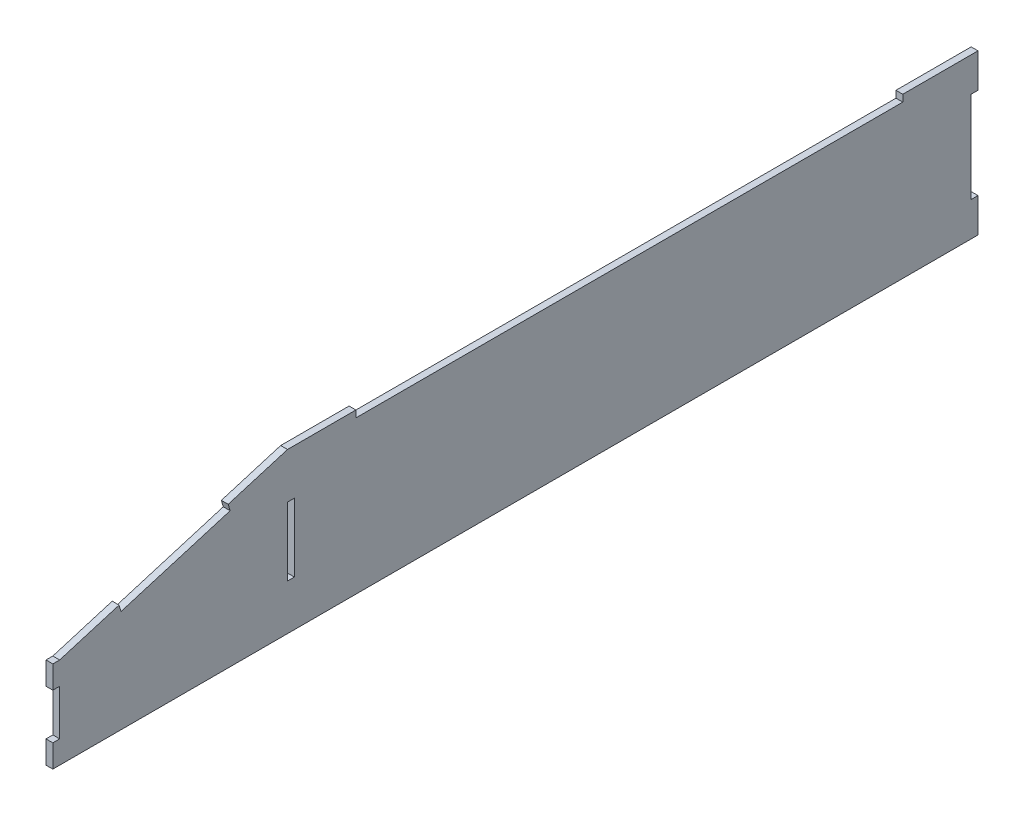
ISO-10303-21;
HEADER;
FILE_DESCRIPTION(('STEP AP214'),'2;1');
FILE_NAME('part.step','',(''),(''),'','','');
FILE_SCHEMA(('AUTOMOTIVE_DESIGN { 1 0 10303 214 1 1 1 1 }'));
ENDSEC;
DATA;
#1=APPLICATION_CONTEXT('core data for automotive mechanical design processes');
#2=APPLICATION_PROTOCOL_DEFINITION('international standard','automotive_design',2000,#1);
#3=PRODUCT_CONTEXT('',#1,'mechanical');
#4=PRODUCT('Part','Part','',(#3));
#5=PRODUCT_RELATED_PRODUCT_CATEGORY('part','',(#4));
#6=PRODUCT_DEFINITION_FORMATION('','',#4);
#7=PRODUCT_DEFINITION_CONTEXT('part definition',#1,'design');
#8=PRODUCT_DEFINITION('design','',#6,#7);
#9=PRODUCT_DEFINITION_SHAPE('','',#8);
#10=(LENGTH_UNIT() NAMED_UNIT(*) SI_UNIT(.MILLI.,.METRE.));
#11=(NAMED_UNIT(*) PLANE_ANGLE_UNIT() SI_UNIT($,.RADIAN.));
#12=(NAMED_UNIT(*) SI_UNIT($,.STERADIAN.) SOLID_ANGLE_UNIT());
#13=UNCERTAINTY_MEASURE_WITH_UNIT(LENGTH_MEASURE(1.E-05),#10,'distance_accuracy_value','');
#14=(GEOMETRIC_REPRESENTATION_CONTEXT(3) GLOBAL_UNCERTAINTY_ASSIGNED_CONTEXT((#13)) GLOBAL_UNIT_ASSIGNED_CONTEXT((#10,
#11,#12)) REPRESENTATION_CONTEXT('',''));
#15=CARTESIAN_POINT('',(0.,0.,0.));
#16=DIRECTION('',(0.,0.,1.));
#17=DIRECTION('',(1.,0.,0.));
#18=AXIS2_PLACEMENT_3D('',#15,#16,#17);
#19=CARTESIAN_POINT('',(3.,40.1738959397817,119.855679605587));
#20=DIRECTION('',(0.,0.,-1.));
#21=DIRECTION('',(-1.,0.,0.));
#22=AXIS2_PLACEMENT_3D('',#19,#20,#21);
#23=PLANE('',#22);
#24=DIRECTION('',(0.,-1.,0.));
#25=VECTOR('',#24,1.);
#26=CARTESIAN_POINT('',(3.,40.1738959397817,119.855679605587));
#27=LINE('',#26,#25);
#28=CARTESIAN_POINT('',(3.,10.1738959397816,119.855679605587));
#29=VERTEX_POINT('',#28);
#30=CARTESIAN_POINT('',(3.,0.173895939781652,119.855679605587));
#31=VERTEX_POINT('',#30);
#32=EDGE_CURVE('E368',#29,#31,#27,.T.);
#33=ORIENTED_EDGE('',*,*,#32,.F.);
#34=DIRECTION('',(-1.,0.,0.));
#35=VECTOR('',#34,1.);
#36=CARTESIAN_POINT('',(518.001516988057,10.1738959397816,119.855679605587));
#37=LINE('',#36,#35);
#38=CARTESIAN_POINT('',(0.,10.1738959397816,119.855679605587));
#39=VERTEX_POINT('',#38);
#40=EDGE_CURVE('E263',#29,#39,#37,.T.);
#41=ORIENTED_EDGE('',*,*,#40,.T.);
#42=DIRECTION('',(0.,-1.,0.));
#43=VECTOR('',#42,1.);
#44=CARTESIAN_POINT('',(0.,40.1738959397817,119.855679605587));
#45=LINE('',#44,#43);
#46=CARTESIAN_POINT('',(0.,0.173895939781652,119.855679605587));
#47=VERTEX_POINT('',#46);
#48=EDGE_CURVE('E389',#39,#47,#45,.T.);
#49=ORIENTED_EDGE('',*,*,#48,.T.);
#50=DIRECTION('',(-1.,0.,0.));
#51=VECTOR('',#50,1.);
#52=CARTESIAN_POINT('',(3.,0.173895939781652,119.855679605587));
#53=LINE('',#52,#51);
#54=EDGE_CURVE('E372',#31,#47,#53,.T.);
#55=ORIENTED_EDGE('',*,*,#54,.F.);
#56=EDGE_LOOP('',(#33,#41,#49,#55));
#57=FACE_BOUND('',#56,.T.);
#58=ADVANCED_FACE('F33',(#57),#23,.F.);
#59=CARTESIAN_POINT('',(3.,40.1738959397817,116.855679605587));
#60=DIRECTION('',(0.,-0.957826285221152,-0.287347885566345));
#61=DIRECTION('',(0.,0.287347885566345,-0.957826285221152));
#62=AXIS2_PLACEMENT_3D('',#59,#60,#61);
#63=PLANE('',#62);
#64=DIRECTION('',(0.,-0.287347885566345,0.957826285221151));
#65=VECTOR('',#64,1.);
#66=CARTESIAN_POINT('',(3.,40.1738959397817,116.855679605587));
#67=LINE('',#66,#65);
#68=CARTESIAN_POINT('',(3.,47.9906391740598,90.7998688246599));
#69=VERTEX_POINT('',#68);
#70=CARTESIAN_POINT('',(3.,40.1738959397817,116.855679605587));
#71=VERTEX_POINT('',#70);
#72=EDGE_CURVE('E362',#69,#71,#67,.T.);
#73=ORIENTED_EDGE('',*,*,#72,.F.);
#74=DIRECTION('',(-1.,0.,0.));
#75=VECTOR('',#74,1.);
#76=CARTESIAN_POINT('',(518.001516988057,47.9906391740598,90.7998688246599));
#77=LINE('',#76,#75);
#78=CARTESIAN_POINT('',(0.,47.9906391740598,90.7998688246599));
#79=VERTEX_POINT('',#78);
#80=EDGE_CURVE('E290',#69,#79,#77,.T.);
#81=ORIENTED_EDGE('',*,*,#80,.T.);
#82=DIRECTION('',(0.,-0.287347885566345,0.957826285221151));
#83=VECTOR('',#82,1.);
#84=CARTESIAN_POINT('',(0.,40.1738959397817,116.855679605587));
#85=LINE('',#84,#83);
#86=CARTESIAN_POINT('',(0.,40.1738959397817,116.855679605587));
#87=VERTEX_POINT('',#86);
#88=EDGE_CURVE('E383',#79,#87,#85,.T.);
#89=ORIENTED_EDGE('',*,*,#88,.T.);
#90=DIRECTION('',(-1.,0.,0.));
#91=VECTOR('',#90,1.);
#92=CARTESIAN_POINT('',(3.,40.1738959397817,116.855679605587));
#93=LINE('',#92,#91);
#94=EDGE_CURVE('E397',#71,#87,#93,.T.);
#95=ORIENTED_EDGE('',*,*,#94,.F.);
#96=EDGE_LOOP('',(#73,#81,#89,#95));
#97=FACE_BOUND('',#96,.T.);
#98=ADVANCED_FACE('F445',(#97),#63,.F.);
#99=CARTESIAN_POINT('',(3.,70.1738959397817,16.855679605587));
#100=DIRECTION('',(0.,-1.,0.));
#101=DIRECTION('',(0.,0.,-1.));
#102=AXIS2_PLACEMENT_3D('',#99,#100,#101);
#103=PLANE('',#102);
#104=DIRECTION('',(0.,0.,1.));
#105=VECTOR('',#104,1.);
#106=CARTESIAN_POINT('',(3.,70.1738959397817,16.855679605587));
#107=LINE('',#106,#105);
#108=CARTESIAN_POINT('',(3.,70.1738959397817,-13.144320394413));
#109=VERTEX_POINT('',#108);
#110=CARTESIAN_POINT('',(3.,70.1738959397817,16.855679605587));
#111=VERTEX_POINT('',#110);
#112=EDGE_CURVE('E358',#109,#111,#107,.T.);
#113=ORIENTED_EDGE('',*,*,#112,.F.);
#114=DIRECTION('',(-1.,0.,0.));
#115=VECTOR('',#114,1.);
#116=CARTESIAN_POINT('',(518.001516988057,70.1738959397817,-13.144320394413));
#117=LINE('',#116,#115);
#118=CARTESIAN_POINT('',(0.,70.1738959397817,-13.144320394413));
#119=VERTEX_POINT('',#118);
#120=EDGE_CURVE('E317',#109,#119,#117,.T.);
#121=ORIENTED_EDGE('',*,*,#120,.T.);
#122=DIRECTION('',(0.,0.,1.));
#123=VECTOR('',#122,1.);
#124=CARTESIAN_POINT('',(0.,70.1738959397817,16.855679605587));
#125=LINE('',#124,#123);
#126=CARTESIAN_POINT('',(0.,70.1738959397817,16.855679605587));
#127=VERTEX_POINT('',#126);
#128=EDGE_CURVE('E379',#119,#127,#125,.T.);
#129=ORIENTED_EDGE('',*,*,#128,.T.);
#130=DIRECTION('',(-1.,0.,0.));
#131=VECTOR('',#130,1.);
#132=CARTESIAN_POINT('',(3.,70.1738959397817,16.855679605587));
#133=LINE('',#132,#131);
#134=EDGE_CURVE('E400',#111,#127,#133,.T.);
#135=ORIENTED_EDGE('',*,*,#134,.F.);
#136=EDGE_LOOP('',(#113,#121,#129,#135));
#137=FACE_BOUND('',#136,.T.);
#138=ADVANCED_FACE('F427',(#137),#103,.F.);
#139=CARTESIAN_POINT('',(3.,0.173895939781676,-286.144320394413));
#140=DIRECTION('',(0.,0.,1.));
#141=DIRECTION('',(1.,0.,0.));
#142=AXIS2_PLACEMENT_3D('',#139,#140,#141);
#143=PLANE('',#142);
#144=DIRECTION('',(-1.,0.,0.));
#145=VECTOR('',#144,1.);
#146=CARTESIAN_POINT('',(521.751516988057,15.1738959397817,-286.144320394413));
#147=LINE('',#146,#145);
#148=CARTESIAN_POINT('',(3.,15.1738959397817,-286.144320394413));
#149=VERTEX_POINT('',#148);
#150=CARTESIAN_POINT('',(0.,15.1738959397817,-286.144320394413));
#151=VERTEX_POINT('',#150);
#152=EDGE_CURVE('E344',#149,#151,#147,.T.);
#153=ORIENTED_EDGE('',*,*,#152,.F.);
#154=DIRECTION('',(0.,1.,0.));
#155=VECTOR('',#154,1.);
#156=CARTESIAN_POINT('',(3.,0.173895939781676,-286.144320394413));
#157=LINE('',#156,#155);
#158=CARTESIAN_POINT('',(3.,0.173895939781676,-286.144320394413));
#159=VERTEX_POINT('',#158);
#160=EDGE_CURVE('E355',#159,#149,#157,.T.);
#161=ORIENTED_EDGE('',*,*,#160,.F.);
#162=DIRECTION('',(-1.,0.,0.));
#163=VECTOR('',#162,1.);
#164=CARTESIAN_POINT('',(3.,0.173895939781676,-286.144320394413));
#165=LINE('',#164,#163);
#166=CARTESIAN_POINT('',(0.,0.173895939781676,-286.144320394413));
#167=VERTEX_POINT('',#166);
#168=EDGE_CURVE('E11',#159,#167,#165,.T.);
#169=ORIENTED_EDGE('',*,*,#168,.T.);
#170=DIRECTION('',(0.,1.,0.));
#171=VECTOR('',#170,1.);
#172=CARTESIAN_POINT('',(0.,0.173895939781676,-286.144320394413));
#173=LINE('',#172,#171);
#174=EDGE_CURVE('E376',#167,#151,#173,.T.);
#175=ORIENTED_EDGE('',*,*,#174,.T.);
#176=EDGE_LOOP('',(#153,#161,#169,#175));
#177=FACE_BOUND('',#176,.T.);
#178=ADVANCED_FACE('F479',(#177),#143,.F.);
#179=DIRECTION('',(-1.,0.,0.));
#180=VECTOR('',#179,1.);
#181=CARTESIAN_POINT('',(521.751516988057,55.1738959397817,-286.144320394413));
#182=LINE('',#181,#180);
#183=CARTESIAN_POINT('',(3.,55.1738959397817,-286.144320394413));
#184=VERTEX_POINT('',#183);
#185=CARTESIAN_POINT('',(0.,55.1738959397817,-286.144320394413));
#186=VERTEX_POINT('',#185);
#187=EDGE_CURVE('E338',#184,#186,#182,.T.);
#188=ORIENTED_EDGE('',*,*,#187,.T.);
#189=CARTESIAN_POINT('',(0.,70.1738959397817,-286.144320394413));
#190=VERTEX_POINT('',#189);
#191=EDGE_CURVE('E375',#186,#190,#173,.T.);
#192=ORIENTED_EDGE('',*,*,#191,.T.);
#193=DIRECTION('',(-1.,0.,0.));
#194=VECTOR('',#193,1.);
#195=CARTESIAN_POINT('',(3.,70.1738959397817,-286.144320394413));
#196=LINE('',#195,#194);
#197=CARTESIAN_POINT('',(3.,70.1738959397817,-286.144320394413));
#198=VERTEX_POINT('',#197);
#199=EDGE_CURVE('E41',#198,#190,#196,.T.);
#200=ORIENTED_EDGE('',*,*,#199,.F.);
#201=EDGE_CURVE('E353',#184,#198,#157,.T.);
#202=ORIENTED_EDGE('',*,*,#201,.F.);
#203=EDGE_LOOP('',(#188,#192,#200,#202));
#204=FACE_BOUND('',#203,.T.);
#205=ADVANCED_FACE('F489',(#204),#143,.F.);
#206=CARTESIAN_POINT('',(3.,0.,0.));
#207=DIRECTION('',(1.,0.,0.));
#208=DIRECTION('',(0.,0.,-1.));
#209=AXIS2_PLACEMENT_3D('',#206,#207,#208);
#210=PLANE('',#209);
#211=DIRECTION('',(0.,0.,1.));
#212=VECTOR('',#211,1.);
#213=CARTESIAN_POINT('',(3.,50.1738959397817,13.855679605587));
#214=LINE('',#213,#212);
#215=CARTESIAN_POINT('',(3.,50.1738959397817,13.855679605587));
#216=VERTEX_POINT('',#215);
#217=CARTESIAN_POINT('',(3.,50.1738959397817,16.855679605587));
#218=VERTEX_POINT('',#217);
#219=EDGE_CURVE('E48',#216,#218,#214,.T.);
#220=ORIENTED_EDGE('',*,*,#219,.F.);
#221=DIRECTION('',(0.,1.,0.));
#222=VECTOR('',#221,1.);
#223=CARTESIAN_POINT('',(3.,20.1738959397817,13.855679605587));
#224=LINE('',#223,#222);
#225=CARTESIAN_POINT('',(3.,20.1738959397817,13.855679605587));
#226=VERTEX_POINT('',#225);
#227=EDGE_CURVE('E224',#226,#216,#224,.T.);
#228=ORIENTED_EDGE('',*,*,#227,.F.);
#229=DIRECTION('',(0.,0.,-1.));
#230=VECTOR('',#229,1.);
#231=CARTESIAN_POINT('',(3.,20.1738959397817,16.855679605587));
#232=LINE('',#231,#230);
#233=CARTESIAN_POINT('',(3.,20.1738959397817,16.855679605587));
#234=VERTEX_POINT('',#233);
#235=EDGE_CURVE('E227',#234,#226,#232,.T.);
#236=ORIENTED_EDGE('',*,*,#235,.F.);
#237=DIRECTION('',(0.,-1.,0.));
#238=VECTOR('',#237,1.);
#239=CARTESIAN_POINT('',(3.,50.1738959397817,16.855679605587));
#240=LINE('',#239,#238);
#241=EDGE_CURVE('E233',#218,#234,#240,.T.);
#242=ORIENTED_EDGE('',*,*,#241,.F.);
#243=EDGE_LOOP('',(#220,#228,#236,#242));
#244=FACE_BOUND('',#243,.T.);
#245=DIRECTION('',(0.,0.,1.));
#246=VECTOR('',#245,1.);
#247=CARTESIAN_POINT('',(3.,10.1738959397816,116.855679605587));
#248=LINE('',#247,#246);
#249=CARTESIAN_POINT('',(3.,10.1738959397816,116.855679605587));
#250=VERTEX_POINT('',#249);
#251=EDGE_CURVE('E246',#250,#29,#248,.T.);
#252=ORIENTED_EDGE('',*,*,#251,.T.);
#253=ORIENTED_EDGE('',*,*,#32,.T.);
#254=DIRECTION('',(0.,0.,-1.));
#255=VECTOR('',#254,1.);
#256=CARTESIAN_POINT('',(3.,0.173895939781652,119.855679605587));
#257=LINE('',#256,#255);
#258=EDGE_CURVE('E350',#31,#159,#257,.T.);
#259=ORIENTED_EDGE('',*,*,#258,.T.);
#260=ORIENTED_EDGE('',*,*,#160,.T.);
#261=DIRECTION('',(0.,0.,-1.));
#262=VECTOR('',#261,1.);
#263=CARTESIAN_POINT('',(3.,15.1738959397817,-283.144320394413));
#264=LINE('',#263,#262);
#265=CARTESIAN_POINT('',(3.,15.1738959397817,-283.144320394413));
#266=VERTEX_POINT('',#265);
#267=EDGE_CURVE('E327',#266,#149,#264,.T.);
#268=ORIENTED_EDGE('',*,*,#267,.F.);
#269=DIRECTION('',(0.,-1.,0.));
#270=VECTOR('',#269,1.);
#271=CARTESIAN_POINT('',(3.,55.1738959397817,-283.144320394413));
#272=LINE('',#271,#270);
#273=CARTESIAN_POINT('',(3.,55.1738959397817,-283.144320394413));
#274=VERTEX_POINT('',#273);
#275=EDGE_CURVE('E324',#274,#266,#272,.T.);
#276=ORIENTED_EDGE('',*,*,#275,.F.);
#277=DIRECTION('',(0.,0.,1.));
#278=VECTOR('',#277,1.);
#279=CARTESIAN_POINT('',(3.,55.1738959397817,-286.144320394413));
#280=LINE('',#279,#278);
#281=EDGE_CURVE('E326',#184,#274,#280,.T.);
#282=ORIENTED_EDGE('',*,*,#281,.F.);
#283=ORIENTED_EDGE('',*,*,#201,.T.);
#284=CARTESIAN_POINT('',(3.,70.1738959397817,-253.144320394413));
#285=VERTEX_POINT('',#284);
#286=EDGE_CURVE('E359',#198,#285,#107,.T.);
#287=ORIENTED_EDGE('',*,*,#286,.T.);
#288=DIRECTION('',(0.,-1.,0.));
#289=VECTOR('',#288,1.);
#290=CARTESIAN_POINT('',(3.,70.1738959397817,-253.144320394413));
#291=LINE('',#290,#289);
#292=CARTESIAN_POINT('',(3.,67.1738959397817,-253.144320394413));
#293=VERTEX_POINT('',#292);
#294=EDGE_CURVE('E299',#285,#293,#291,.T.);
#295=ORIENTED_EDGE('',*,*,#294,.T.);
#296=DIRECTION('',(0.,0.,1.));
#297=VECTOR('',#296,1.);
#298=CARTESIAN_POINT('',(3.,67.1738959397817,-253.144320394413));
#299=LINE('',#298,#297);
#300=CARTESIAN_POINT('',(3.,67.1738959397817,-13.144320394413));
#301=VERTEX_POINT('',#300);
#302=EDGE_CURVE('E297',#293,#301,#299,.T.);
#303=ORIENTED_EDGE('',*,*,#302,.T.);
#304=DIRECTION('',(0.,1.,0.));
#305=VECTOR('',#304,1.);
#306=CARTESIAN_POINT('',(3.,67.1738959397817,-13.144320394413));
#307=LINE('',#306,#305);
#308=EDGE_CURVE('E300',#301,#109,#307,.T.);
#309=ORIENTED_EDGE('',*,*,#308,.T.);
#310=ORIENTED_EDGE('',*,*,#112,.T.);
#311=CARTESIAN_POINT('',(3.,62.3580334523771,42.9085545636023));
#312=VERTEX_POINT('',#311);
#313=EDGE_CURVE('E363',#111,#312,#67,.T.);
#314=ORIENTED_EDGE('',*,*,#313,.T.);
#315=DIRECTION('',(0.,-0.957826285221151,-0.287347885566347));
#316=VECTOR('',#315,1.);
#317=CARTESIAN_POINT('',(3.,62.3580334523771,42.9085545636023));
#318=LINE('',#317,#316);
#319=CARTESIAN_POINT('',(3.,59.4845545967136,42.0465109069033));
#320=VERTEX_POINT('',#319);
#321=EDGE_CURVE('E272',#312,#320,#318,.T.);
#322=ORIENTED_EDGE('',*,*,#321,.T.);
#323=DIRECTION('',(0.,-0.287347885566347,0.957826285221151));
#324=VECTOR('',#323,1.);
#325=CARTESIAN_POINT('',(3.,59.4845545967136,42.0465109069033));
#326=LINE('',#325,#324);
#327=CARTESIAN_POINT('',(3.,45.1171603183962,89.9378251679608));
#328=VERTEX_POINT('',#327);
#329=EDGE_CURVE('E270',#320,#328,#326,.T.);
#330=ORIENTED_EDGE('',*,*,#329,.T.);
#331=DIRECTION('',(0.,0.957826285221151,0.287347885566349));
#332=VECTOR('',#331,1.);
#333=CARTESIAN_POINT('',(3.,45.1171603183963,89.9378251679608));
#334=LINE('',#333,#332);
#335=EDGE_CURVE('E273',#328,#69,#334,.T.);
#336=ORIENTED_EDGE('',*,*,#335,.T.);
#337=ORIENTED_EDGE('',*,*,#72,.T.);
#338=DIRECTION('',(0.,0.,1.));
#339=VECTOR('',#338,1.);
#340=CARTESIAN_POINT('',(3.,40.1738959397817,119.855679605587));
#341=LINE('',#340,#339);
#342=CARTESIAN_POINT('',(3.,40.1738959397817,119.855679605587));
#343=VERTEX_POINT('',#342);
#344=EDGE_CURVE('E366',#71,#343,#341,.T.);
#345=ORIENTED_EDGE('',*,*,#344,.T.);
#346=CARTESIAN_POINT('',(3.,30.1738959397816,119.855679605587));
#347=VERTEX_POINT('',#346);
#348=EDGE_CURVE('E369',#343,#347,#27,.T.);
#349=ORIENTED_EDGE('',*,*,#348,.T.);
#350=DIRECTION('',(0.,0.,-1.));
#351=VECTOR('',#350,1.);
#352=CARTESIAN_POINT('',(3.,30.1738959397816,119.855679605587));
#353=LINE('',#352,#351);
#354=CARTESIAN_POINT('',(3.,30.1738959397817,116.855679605587));
#355=VERTEX_POINT('',#354);
#356=EDGE_CURVE('E245',#347,#355,#353,.T.);
#357=ORIENTED_EDGE('',*,*,#356,.T.);
#358=DIRECTION('',(0.,-1.,0.));
#359=VECTOR('',#358,1.);
#360=CARTESIAN_POINT('',(3.,30.1738959397817,116.855679605587));
#361=LINE('',#360,#359);
#362=EDGE_CURVE('E243',#355,#250,#361,.T.);
#363=ORIENTED_EDGE('',*,*,#362,.T.);
#364=EDGE_LOOP('',(#252,#253,#259,#260,#268,#276,#282,#283,#287,#295,#303,#309,#310,#314,#322,
#330,#336,#337,#345,#349,#357,#363));
#365=FACE_BOUND('',#364,.T.);
#366=ADVANCED_FACE('F421',(#244,#365),#210,.T.);
#367=CARTESIAN_POINT('',(3.,0.173895939781652,119.855679605587));
#368=DIRECTION('',(0.,1.,0.));
#369=DIRECTION('',(0.,0.,1.));
#370=AXIS2_PLACEMENT_3D('',#367,#368,#369);
#371=PLANE('',#370);
#372=DIRECTION('',(0.,0.,-1.));
#373=VECTOR('',#372,1.);
#374=CARTESIAN_POINT('',(0.,0.173895939781652,119.855679605587));
#375=LINE('',#374,#373);
#376=EDGE_CURVE('E329',#47,#167,#375,.T.);
#377=ORIENTED_EDGE('',*,*,#376,.T.);
#378=ORIENTED_EDGE('',*,*,#168,.F.);
#379=ORIENTED_EDGE('',*,*,#258,.F.);
#380=ORIENTED_EDGE('',*,*,#54,.T.);
#381=EDGE_LOOP('',(#377,#378,#379,#380));
#382=FACE_BOUND('',#381,.T.);
#383=ADVANCED_FACE('F35',(#382),#371,.F.);
#384=CARTESIAN_POINT('',(0.,70.1738959397817,-253.144320394413));
#385=VERTEX_POINT('',#384);
#386=EDGE_CURVE('E380',#190,#385,#125,.T.);
#387=ORIENTED_EDGE('',*,*,#386,.T.);
#388=DIRECTION('',(-1.,0.,0.));
#389=VECTOR('',#388,1.);
#390=CARTESIAN_POINT('',(518.001516988057,70.1738959397817,-253.144320394413));
#391=LINE('',#390,#389);
#392=EDGE_CURVE('E311',#285,#385,#391,.T.);
#393=ORIENTED_EDGE('',*,*,#392,.F.);
#394=ORIENTED_EDGE('',*,*,#286,.F.);
#395=ORIENTED_EDGE('',*,*,#199,.T.);
#396=EDGE_LOOP('',(#387,#393,#394,#395));
#397=FACE_BOUND('',#396,.T.);
#398=ADVANCED_FACE('F407',(#397),#103,.F.);
#399=CARTESIAN_POINT('',(0.,62.3580334523771,42.9085545636023));
#400=VERTEX_POINT('',#399);
#401=EDGE_CURVE('E384',#127,#400,#85,.T.);
#402=ORIENTED_EDGE('',*,*,#401,.T.);
#403=DIRECTION('',(-1.,0.,0.));
#404=VECTOR('',#403,1.);
#405=CARTESIAN_POINT('',(518.001516988057,62.3580334523771,42.9085545636023));
#406=LINE('',#405,#404);
#407=EDGE_CURVE('E284',#312,#400,#406,.T.);
#408=ORIENTED_EDGE('',*,*,#407,.F.);
#409=ORIENTED_EDGE('',*,*,#313,.F.);
#410=ORIENTED_EDGE('',*,*,#134,.T.);
#411=EDGE_LOOP('',(#402,#408,#409,#410));
#412=FACE_BOUND('',#411,.T.);
#413=ADVANCED_FACE('F504',(#412),#63,.F.);
#414=CARTESIAN_POINT('',(3.,40.1738959397817,119.855679605587));
#415=DIRECTION('',(0.,-1.,0.));
#416=DIRECTION('',(0.,0.,-1.));
#417=AXIS2_PLACEMENT_3D('',#414,#415,#416);
#418=PLANE('',#417);
#419=DIRECTION('',(0.,0.,1.));
#420=VECTOR('',#419,1.);
#421=CARTESIAN_POINT('',(0.,40.1738959397817,119.855679605587));
#422=LINE('',#421,#420);
#423=CARTESIAN_POINT('',(0.,40.1738959397817,119.855679605587));
#424=VERTEX_POINT('',#423);
#425=EDGE_CURVE('E387',#87,#424,#422,.T.);
#426=ORIENTED_EDGE('',*,*,#425,.T.);
#427=DIRECTION('',(-1.,0.,0.));
#428=VECTOR('',#427,1.);
#429=CARTESIAN_POINT('',(3.,40.1738959397817,119.855679605587));
#430=LINE('',#429,#428);
#431=EDGE_CURVE('E394',#343,#424,#430,.T.);
#432=ORIENTED_EDGE('',*,*,#431,.F.);
#433=ORIENTED_EDGE('',*,*,#344,.F.);
#434=ORIENTED_EDGE('',*,*,#94,.T.);
#435=EDGE_LOOP('',(#426,#432,#433,#434));
#436=FACE_BOUND('',#435,.T.);
#437=ADVANCED_FACE('F452',(#436),#418,.F.);
#438=CARTESIAN_POINT('',(0.,30.1738959397816,119.855679605587));
#439=VERTEX_POINT('',#438);
#440=EDGE_CURVE('E354',#424,#439,#45,.T.);
#441=ORIENTED_EDGE('',*,*,#440,.T.);
#442=DIRECTION('',(-1.,0.,0.));
#443=VECTOR('',#442,1.);
#444=CARTESIAN_POINT('',(518.001516988057,30.1738959397816,119.855679605587));
#445=LINE('',#444,#443);
#446=EDGE_CURVE('E257',#347,#439,#445,.T.);
#447=ORIENTED_EDGE('',*,*,#446,.F.);
#448=ORIENTED_EDGE('',*,*,#348,.F.);
#449=ORIENTED_EDGE('',*,*,#431,.T.);
#450=EDGE_LOOP('',(#441,#447,#448,#449));
#451=FACE_BOUND('',#450,.T.);
#452=ADVANCED_FACE('F456',(#451),#23,.F.);
#453=CARTESIAN_POINT('',(0.,0.,0.));
#454=DIRECTION('',(1.,0.,0.));
#455=DIRECTION('',(0.,0.,-1.));
#456=AXIS2_PLACEMENT_3D('',#453,#454,#455);
#457=PLANE('',#456);
#458=DIRECTION('',(0.,1.,0.));
#459=VECTOR('',#458,1.);
#460=CARTESIAN_POINT('',(0.,20.1738959397817,13.855679605587));
#461=LINE('',#460,#459);
#462=CARTESIAN_POINT('',(0.,20.1738959397817,13.855679605587));
#463=VERTEX_POINT('',#462);
#464=CARTESIAN_POINT('',(0.,50.1738959397817,13.855679605587));
#465=VERTEX_POINT('',#464);
#466=EDGE_CURVE('E214',#463,#465,#461,.T.);
#467=ORIENTED_EDGE('',*,*,#466,.T.);
#468=DIRECTION('',(0.,0.,1.));
#469=VECTOR('',#468,1.);
#470=CARTESIAN_POINT('',(0.,50.1738959397817,13.855679605587));
#471=LINE('',#470,#469);
#472=CARTESIAN_POINT('',(0.,50.1738959397817,16.855679605587));
#473=VERTEX_POINT('',#472);
#474=EDGE_CURVE('E208',#465,#473,#471,.T.);
#475=ORIENTED_EDGE('',*,*,#474,.T.);
#476=DIRECTION('',(0.,-1.,0.));
#477=VECTOR('',#476,1.);
#478=CARTESIAN_POINT('',(0.,50.1738959397817,16.855679605587));
#479=LINE('',#478,#477);
#480=CARTESIAN_POINT('',(0.,20.1738959397817,16.855679605587));
#481=VERTEX_POINT('',#480);
#482=EDGE_CURVE('E217',#473,#481,#479,.T.);
#483=ORIENTED_EDGE('',*,*,#482,.T.);
#484=DIRECTION('',(0.,0.,-1.));
#485=VECTOR('',#484,1.);
#486=CARTESIAN_POINT('',(0.,20.1738959397817,16.855679605587));
#487=LINE('',#486,#485);
#488=EDGE_CURVE('E56',#481,#463,#487,.T.);
#489=ORIENTED_EDGE('',*,*,#488,.T.);
#490=EDGE_LOOP('',(#467,#475,#483,#489));
#491=FACE_BOUND('',#490,.T.);
#492=DIRECTION('',(0.,-1.,0.));
#493=VECTOR('',#492,1.);
#494=CARTESIAN_POINT('',(0.,30.1738959397817,116.855679605587));
#495=LINE('',#494,#493);
#496=CARTESIAN_POINT('',(0.,30.1738959397817,116.855679605587));
#497=VERTEX_POINT('',#496);
#498=CARTESIAN_POINT('',(0.,10.1738959397816,116.855679605587));
#499=VERTEX_POINT('',#498);
#500=EDGE_CURVE('E251',#497,#499,#495,.T.);
#501=ORIENTED_EDGE('',*,*,#500,.F.);
#502=DIRECTION('',(0.,0.,-1.));
#503=VECTOR('',#502,1.);
#504=CARTESIAN_POINT('',(0.,30.1738959397816,119.855679605587));
#505=LINE('',#504,#503);
#506=EDGE_CURVE('E239',#439,#497,#505,.T.);
#507=ORIENTED_EDGE('',*,*,#506,.F.);
#508=ORIENTED_EDGE('',*,*,#440,.F.);
#509=ORIENTED_EDGE('',*,*,#425,.F.);
#510=ORIENTED_EDGE('',*,*,#88,.F.);
#511=DIRECTION('',(0.,0.957826285221151,0.287347885566349));
#512=VECTOR('',#511,1.);
#513=CARTESIAN_POINT('',(0.,45.1171603183963,89.9378251679608));
#514=LINE('',#513,#512);
#515=CARTESIAN_POINT('',(0.,45.1171603183963,89.9378251679608));
#516=VERTEX_POINT('',#515);
#517=EDGE_CURVE('E281',#516,#79,#514,.T.);
#518=ORIENTED_EDGE('',*,*,#517,.F.);
#519=DIRECTION('',(0.,-0.287347885566347,0.957826285221151));
#520=VECTOR('',#519,1.);
#521=CARTESIAN_POINT('',(0.,59.4845545967136,42.0465109069033));
#522=LINE('',#521,#520);
#523=CARTESIAN_POINT('',(0.,59.4845545967136,42.0465109069033));
#524=VERTEX_POINT('',#523);
#525=EDGE_CURVE('E278',#524,#516,#522,.T.);
#526=ORIENTED_EDGE('',*,*,#525,.F.);
#527=DIRECTION('',(0.,-0.957826285221151,-0.287347885566347));
#528=VECTOR('',#527,1.);
#529=CARTESIAN_POINT('',(0.,62.3580334523771,42.9085545636023));
#530=LINE('',#529,#528);
#531=EDGE_CURVE('E248',#400,#524,#530,.T.);
#532=ORIENTED_EDGE('',*,*,#531,.F.);
#533=ORIENTED_EDGE('',*,*,#401,.F.);
#534=ORIENTED_EDGE('',*,*,#128,.F.);
#535=DIRECTION('',(0.,1.,0.));
#536=VECTOR('',#535,1.);
#537=CARTESIAN_POINT('',(0.,67.1738959397817,-13.144320394413));
#538=LINE('',#537,#536);
#539=CARTESIAN_POINT('',(0.,67.1738959397817,-13.144320394413));
#540=VERTEX_POINT('',#539);
#541=EDGE_CURVE('E308',#540,#119,#538,.T.);
#542=ORIENTED_EDGE('',*,*,#541,.F.);
#543=DIRECTION('',(0.,0.,1.));
#544=VECTOR('',#543,1.);
#545=CARTESIAN_POINT('',(0.,67.1738959397817,-253.144320394413));
#546=LINE('',#545,#544);
#547=CARTESIAN_POINT('',(0.,67.1738959397817,-253.144320394413));
#548=VERTEX_POINT('',#547);
#549=EDGE_CURVE('E305',#548,#540,#546,.T.);
#550=ORIENTED_EDGE('',*,*,#549,.F.);
#551=DIRECTION('',(0.,-1.,0.));
#552=VECTOR('',#551,1.);
#553=CARTESIAN_POINT('',(0.,70.1738959397817,-253.144320394413));
#554=LINE('',#553,#552);
#555=EDGE_CURVE('E275',#385,#548,#554,.T.);
#556=ORIENTED_EDGE('',*,*,#555,.F.);
#557=ORIENTED_EDGE('',*,*,#386,.F.);
#558=ORIENTED_EDGE('',*,*,#191,.F.);
#559=DIRECTION('',(0.,0.,1.));
#560=VECTOR('',#559,1.);
#561=CARTESIAN_POINT('',(0.,55.1738959397817,-286.144320394413));
#562=LINE('',#561,#560);
#563=CARTESIAN_POINT('',(0.,55.1738959397817,-283.144320394413));
#564=VERTEX_POINT('',#563);
#565=EDGE_CURVE('E302',#186,#564,#562,.T.);
#566=ORIENTED_EDGE('',*,*,#565,.T.);
#567=DIRECTION('',(0.,-1.,0.));
#568=VECTOR('',#567,1.);
#569=CARTESIAN_POINT('',(0.,55.1738959397817,-283.144320394413));
#570=LINE('',#569,#568);
#571=CARTESIAN_POINT('',(0.,15.1738959397817,-283.144320394413));
#572=VERTEX_POINT('',#571);
#573=EDGE_CURVE('E332',#564,#572,#570,.T.);
#574=ORIENTED_EDGE('',*,*,#573,.T.);
#575=DIRECTION('',(0.,0.,-1.));
#576=VECTOR('',#575,1.);
#577=CARTESIAN_POINT('',(0.,15.1738959397817,-283.144320394413));
#578=LINE('',#577,#576);
#579=EDGE_CURVE('E335',#572,#151,#578,.T.);
#580=ORIENTED_EDGE('',*,*,#579,.T.);
#581=ORIENTED_EDGE('',*,*,#174,.F.);
#582=ORIENTED_EDGE('',*,*,#376,.F.);
#583=ORIENTED_EDGE('',*,*,#48,.F.);
#584=DIRECTION('',(0.,0.,1.));
#585=VECTOR('',#584,1.);
#586=CARTESIAN_POINT('',(0.,10.1738959397816,116.855679605587));
#587=LINE('',#586,#585);
#588=EDGE_CURVE('E254',#499,#39,#587,.T.);
#589=ORIENTED_EDGE('',*,*,#588,.F.);
#590=EDGE_LOOP('',(#501,#507,#508,#509,#510,#518,#526,#532,#533,#534,#542,#550,#556,#557,#558,
#566,#574,#580,#581,#582,#583,#589));
#591=FACE_BOUND('',#590,.T.);
#592=ADVANCED_FACE('F221',(#491,#591),#457,.F.);
#593=CARTESIAN_POINT('',(521.751516988057,15.1738959397817,-283.144320394413));
#594=DIRECTION('',(0.,1.,0.));
#595=DIRECTION('',(0.,0.,1.));
#596=AXIS2_PLACEMENT_3D('',#593,#594,#595);
#597=PLANE('',#596);
#598=DIRECTION('',(-1.,0.,0.));
#599=VECTOR('',#598,1.);
#600=CARTESIAN_POINT('',(521.751516988057,15.1738959397817,-283.144320394413));
#601=LINE('',#600,#599);
#602=EDGE_CURVE('E346',#266,#572,#601,.T.);
#603=ORIENTED_EDGE('',*,*,#602,.F.);
#604=ORIENTED_EDGE('',*,*,#267,.T.);
#605=ORIENTED_EDGE('',*,*,#152,.T.);
#606=ORIENTED_EDGE('',*,*,#579,.F.);
#607=EDGE_LOOP('',(#603,#604,#605,#606));
#608=FACE_BOUND('',#607,.T.);
#609=ADVANCED_FACE('F482',(#608),#597,.T.);
#610=CARTESIAN_POINT('',(521.751516988057,55.1738959397817,-283.144320394413));
#611=DIRECTION('',(0.,0.,-1.));
#612=DIRECTION('',(-1.,0.,0.));
#613=AXIS2_PLACEMENT_3D('',#610,#611,#612);
#614=PLANE('',#613);
#615=DIRECTION('',(-1.,0.,0.));
#616=VECTOR('',#615,1.);
#617=CARTESIAN_POINT('',(521.751516988057,55.1738959397817,-283.144320394413));
#618=LINE('',#617,#616);
#619=EDGE_CURVE('E341',#274,#564,#618,.T.);
#620=ORIENTED_EDGE('',*,*,#619,.F.);
#621=ORIENTED_EDGE('',*,*,#275,.T.);
#622=ORIENTED_EDGE('',*,*,#602,.T.);
#623=ORIENTED_EDGE('',*,*,#573,.F.);
#624=EDGE_LOOP('',(#620,#621,#622,#623));
#625=FACE_BOUND('',#624,.T.);
#626=ADVANCED_FACE('F485',(#625),#614,.T.);
#627=CARTESIAN_POINT('',(521.751516988057,55.1738959397817,-286.144320394413));
#628=DIRECTION('',(0.,-1.,0.));
#629=DIRECTION('',(0.,0.,-1.));
#630=AXIS2_PLACEMENT_3D('',#627,#628,#629);
#631=PLANE('',#630);
#632=ORIENTED_EDGE('',*,*,#187,.F.);
#633=ORIENTED_EDGE('',*,*,#281,.T.);
#634=ORIENTED_EDGE('',*,*,#619,.T.);
#635=ORIENTED_EDGE('',*,*,#565,.F.);
#636=EDGE_LOOP('',(#632,#633,#634,#635));
#637=FACE_BOUND('',#636,.T.);
#638=ADVANCED_FACE('F487',(#637),#631,.T.);
#639=CARTESIAN_POINT('',(518.001516988057,67.1738959397817,-13.144320394413));
#640=DIRECTION('',(0.,0.,1.));
#641=DIRECTION('',(1.,0.,0.));
#642=AXIS2_PLACEMENT_3D('',#639,#640,#641);
#643=PLANE('',#642);
#644=DIRECTION('',(-1.,0.,0.));
#645=VECTOR('',#644,1.);
#646=CARTESIAN_POINT('',(518.001516988057,67.1738959397817,-13.144320394413));
#647=LINE('',#646,#645);
#648=EDGE_CURVE('E320',#301,#540,#647,.T.);
#649=ORIENTED_EDGE('',*,*,#648,.T.);
#650=ORIENTED_EDGE('',*,*,#541,.T.);
#651=ORIENTED_EDGE('',*,*,#120,.F.);
#652=ORIENTED_EDGE('',*,*,#308,.F.);
#653=EDGE_LOOP('',(#649,#650,#651,#652));
#654=FACE_BOUND('',#653,.T.);
#655=ADVANCED_FACE('F425',(#654),#643,.F.);
#656=CARTESIAN_POINT('',(518.001516988057,67.1738959397817,-253.144320394413));
#657=DIRECTION('',(0.,-1.,0.));
#658=DIRECTION('',(0.,0.,-1.));
#659=AXIS2_PLACEMENT_3D('',#656,#657,#658);
#660=PLANE('',#659);
#661=DIRECTION('',(-1.,0.,0.));
#662=VECTOR('',#661,1.);
#663=CARTESIAN_POINT('',(518.001516988057,67.1738959397817,-253.144320394413));
#664=LINE('',#663,#662);
#665=EDGE_CURVE('E314',#293,#548,#664,.T.);
#666=ORIENTED_EDGE('',*,*,#665,.T.);
#667=ORIENTED_EDGE('',*,*,#549,.T.);
#668=ORIENTED_EDGE('',*,*,#648,.F.);
#669=ORIENTED_EDGE('',*,*,#302,.F.);
#670=EDGE_LOOP('',(#666,#667,#668,#669));
#671=FACE_BOUND('',#670,.T.);
#672=ADVANCED_FACE('F417',(#671),#660,.F.);
#673=CARTESIAN_POINT('',(518.001516988057,70.1738959397817,-253.144320394413));
#674=DIRECTION('',(0.,0.,-1.));
#675=DIRECTION('',(-1.,0.,0.));
#676=AXIS2_PLACEMENT_3D('',#673,#674,#675);
#677=PLANE('',#676);
#678=ORIENTED_EDGE('',*,*,#392,.T.);
#679=ORIENTED_EDGE('',*,*,#555,.T.);
#680=ORIENTED_EDGE('',*,*,#665,.F.);
#681=ORIENTED_EDGE('',*,*,#294,.F.);
#682=EDGE_LOOP('',(#678,#679,#680,#681));
#683=FACE_BOUND('',#682,.T.);
#684=ADVANCED_FACE('F413',(#683),#677,.F.);
#685=CARTESIAN_POINT('',(518.001516988057,45.1171603183963,89.9378251679608));
#686=DIRECTION('',(0.,-0.287347885566349,0.95782628522115));
#687=DIRECTION('',(0.,-0.957826285221151,-0.287347885566349));
#688=AXIS2_PLACEMENT_3D('',#685,#686,#687);
#689=PLANE('',#688);
#690=DIRECTION('',(-1.,0.,0.));
#691=VECTOR('',#690,1.);
#692=CARTESIAN_POINT('',(518.001516988057,45.1171603183963,89.9378251679608));
#693=LINE('',#692,#691);
#694=EDGE_CURVE('E293',#328,#516,#693,.T.);
#695=ORIENTED_EDGE('',*,*,#694,.T.);
#696=ORIENTED_EDGE('',*,*,#517,.T.);
#697=ORIENTED_EDGE('',*,*,#80,.F.);
#698=ORIENTED_EDGE('',*,*,#335,.F.);
#699=EDGE_LOOP('',(#695,#696,#697,#698));
#700=FACE_BOUND('',#699,.T.);
#701=ADVANCED_FACE('F443',(#700),#689,.F.);
#702=CARTESIAN_POINT('',(518.001516988057,59.4845545967136,42.0465109069033));
#703=DIRECTION('',(0.,-0.957826285221151,-0.287347885566347));
#704=DIRECTION('',(0.,0.287347885566347,-0.957826285221151));
#705=AXIS2_PLACEMENT_3D('',#702,#703,#704);
#706=PLANE('',#705);
#707=DIRECTION('',(-1.,0.,0.));
#708=VECTOR('',#707,1.);
#709=CARTESIAN_POINT('',(518.001516988057,59.4845545967136,42.0465109069033));
#710=LINE('',#709,#708);
#711=EDGE_CURVE('E287',#320,#524,#710,.T.);
#712=ORIENTED_EDGE('',*,*,#711,.T.);
#713=ORIENTED_EDGE('',*,*,#525,.T.);
#714=ORIENTED_EDGE('',*,*,#694,.F.);
#715=ORIENTED_EDGE('',*,*,#329,.F.);
#716=EDGE_LOOP('',(#712,#713,#714,#715));
#717=FACE_BOUND('',#716,.T.);
#718=ADVANCED_FACE('F437',(#717),#706,.F.);
#719=CARTESIAN_POINT('',(518.001516988057,62.3580334523771,42.9085545636023));
#720=DIRECTION('',(0.,0.287347885566347,-0.957826285221151));
#721=DIRECTION('',(0.,0.957826285221151,0.287347885566347));
#722=AXIS2_PLACEMENT_3D('',#719,#720,#721);
#723=PLANE('',#722);
#724=ORIENTED_EDGE('',*,*,#407,.T.);
#725=ORIENTED_EDGE('',*,*,#531,.T.);
#726=ORIENTED_EDGE('',*,*,#711,.F.);
#727=ORIENTED_EDGE('',*,*,#321,.F.);
#728=EDGE_LOOP('',(#724,#725,#726,#727));
#729=FACE_BOUND('',#728,.T.);
#730=ADVANCED_FACE('F435',(#729),#723,.F.);
#731=CARTESIAN_POINT('',(518.001516988057,10.1738959397816,116.855679605587));
#732=DIRECTION('',(0.,-1.,0.));
#733=DIRECTION('',(0.,0.,-1.));
#734=AXIS2_PLACEMENT_3D('',#731,#732,#733);
#735=PLANE('',#734);
#736=DIRECTION('',(-1.,0.,0.));
#737=VECTOR('',#736,1.);
#738=CARTESIAN_POINT('',(518.001516988057,10.1738959397816,116.855679605587));
#739=LINE('',#738,#737);
#740=EDGE_CURVE('E266',#250,#499,#739,.T.);
#741=ORIENTED_EDGE('',*,*,#740,.T.);
#742=ORIENTED_EDGE('',*,*,#588,.T.);
#743=ORIENTED_EDGE('',*,*,#40,.F.);
#744=ORIENTED_EDGE('',*,*,#251,.F.);
#745=EDGE_LOOP('',(#741,#742,#743,#744));
#746=FACE_BOUND('',#745,.T.);
#747=ADVANCED_FACE('F466',(#746),#735,.F.);
#748=CARTESIAN_POINT('',(518.001516988057,30.1738959397817,116.855679605587));
#749=DIRECTION('',(0.,0.,-1.));
#750=DIRECTION('',(0.,1.,0.));
#751=AXIS2_PLACEMENT_3D('',#748,#749,#750);
#752=PLANE('',#751);
#753=DIRECTION('',(-1.,0.,0.));
#754=VECTOR('',#753,1.);
#755=CARTESIAN_POINT('',(518.001516988057,30.1738959397817,116.855679605587));
#756=LINE('',#755,#754);
#757=EDGE_CURVE('E260',#355,#497,#756,.T.);
#758=ORIENTED_EDGE('',*,*,#757,.T.);
#759=ORIENTED_EDGE('',*,*,#500,.T.);
#760=ORIENTED_EDGE('',*,*,#740,.F.);
#761=ORIENTED_EDGE('',*,*,#362,.F.);
#762=EDGE_LOOP('',(#758,#759,#760,#761));
#763=FACE_BOUND('',#762,.T.);
#764=ADVANCED_FACE('F464',(#763),#752,.F.);
#765=CARTESIAN_POINT('',(518.001516988057,30.1738959397816,119.855679605587));
#766=DIRECTION('',(0.,1.,0.));
#767=DIRECTION('',(0.,0.,1.));
#768=AXIS2_PLACEMENT_3D('',#765,#766,#767);
#769=PLANE('',#768);
#770=ORIENTED_EDGE('',*,*,#446,.T.);
#771=ORIENTED_EDGE('',*,*,#506,.T.);
#772=ORIENTED_EDGE('',*,*,#757,.F.);
#773=ORIENTED_EDGE('',*,*,#356,.F.);
#774=EDGE_LOOP('',(#770,#771,#772,#773));
#775=FACE_BOUND('',#774,.T.);
#776=ADVANCED_FACE('F458',(#775),#769,.F.);
#777=CARTESIAN_POINT('',(0.,50.1738959397817,13.855679605587));
#778=DIRECTION('',(0.,1.,0.));
#779=DIRECTION('',(0.,0.,1.));
#780=AXIS2_PLACEMENT_3D('',#777,#778,#779);
#781=PLANE('',#780);
#782=ORIENTED_EDGE('',*,*,#219,.T.);
#783=DIRECTION('',(1.,0.,0.));
#784=VECTOR('',#783,1.);
#785=CARTESIAN_POINT('',(0.,50.1738959397817,16.855679605587));
#786=LINE('',#785,#784);
#787=EDGE_CURVE('E204',#473,#218,#786,.T.);
#788=ORIENTED_EDGE('',*,*,#787,.F.);
#789=ORIENTED_EDGE('',*,*,#474,.F.);
#790=DIRECTION('',(1.,0.,0.));
#791=VECTOR('',#790,1.);
#792=CARTESIAN_POINT('',(0.,50.1738959397817,13.855679605587));
#793=LINE('',#792,#791);
#794=EDGE_CURVE('E237',#465,#216,#793,.T.);
#795=ORIENTED_EDGE('',*,*,#794,.T.);
#796=EDGE_LOOP('',(#782,#788,#789,#795));
#797=FACE_BOUND('',#796,.T.);
#798=ADVANCED_FACE('F206',(#797),#781,.F.);
#799=CARTESIAN_POINT('',(0.,20.1738959397817,13.855679605587));
#800=DIRECTION('',(0.,0.,-1.));
#801=DIRECTION('',(0.,1.,0.));
#802=AXIS2_PLACEMENT_3D('',#799,#800,#801);
#803=PLANE('',#802);
#804=ORIENTED_EDGE('',*,*,#227,.T.);
#805=ORIENTED_EDGE('',*,*,#794,.F.);
#806=ORIENTED_EDGE('',*,*,#466,.F.);
#807=DIRECTION('',(1.,0.,0.));
#808=VECTOR('',#807,1.);
#809=CARTESIAN_POINT('',(0.,20.1738959397817,13.855679605587));
#810=LINE('',#809,#808);
#811=EDGE_CURVE('E240',#463,#226,#810,.T.);
#812=ORIENTED_EDGE('',*,*,#811,.T.);
#813=EDGE_LOOP('',(#804,#805,#806,#812));
#814=FACE_BOUND('',#813,.T.);
#815=ADVANCED_FACE('F624',(#814),#803,.F.);
#816=CARTESIAN_POINT('',(0.,20.1738959397817,16.855679605587));
#817=DIRECTION('',(0.,-1.,0.));
#818=DIRECTION('',(0.,0.,-1.));
#819=AXIS2_PLACEMENT_3D('',#816,#817,#818);
#820=PLANE('',#819);
#821=ORIENTED_EDGE('',*,*,#235,.T.);
#822=ORIENTED_EDGE('',*,*,#811,.F.);
#823=ORIENTED_EDGE('',*,*,#488,.F.);
#824=DIRECTION('',(1.,0.,0.));
#825=VECTOR('',#824,1.);
#826=CARTESIAN_POINT('',(0.,20.1738959397817,16.855679605587));
#827=LINE('',#826,#825);
#828=EDGE_CURVE('E213',#481,#234,#827,.T.);
#829=ORIENTED_EDGE('',*,*,#828,.T.);
#830=EDGE_LOOP('',(#821,#822,#823,#829));
#831=FACE_BOUND('',#830,.T.);
#832=ADVANCED_FACE('F632',(#831),#820,.F.);
#833=CARTESIAN_POINT('',(0.,50.1738959397817,16.855679605587));
#834=DIRECTION('',(0.,0.,1.));
#835=DIRECTION('',(0.,-1.,0.));
#836=AXIS2_PLACEMENT_3D('',#833,#834,#835);
#837=PLANE('',#836);
#838=ORIENTED_EDGE('',*,*,#241,.T.);
#839=ORIENTED_EDGE('',*,*,#828,.F.);
#840=ORIENTED_EDGE('',*,*,#482,.F.);
#841=ORIENTED_EDGE('',*,*,#787,.T.);
#842=EDGE_LOOP('',(#838,#839,#840,#841));
#843=FACE_BOUND('',#842,.T.);
#844=ADVANCED_FACE('F218',(#843),#837,.F.);
#845=CLOSED_SHELL('',(#58,#98,#138,#178,#205,#366,#383,#398,#413,#437,#452,#592,#609,#626,#638,
#655,#672,#684,#701,#718,#730,#747,#764,#776,#798,#815,#832,#844));
#846=MANIFOLD_SOLID_BREP('B2',#845);
#847=ADVANCED_BREP_SHAPE_REPRESENTATION('',(#18,#846),#14);
#848=SHAPE_DEFINITION_REPRESENTATION(#9,#847);
ENDSEC;
END-ISO-10303-21;
